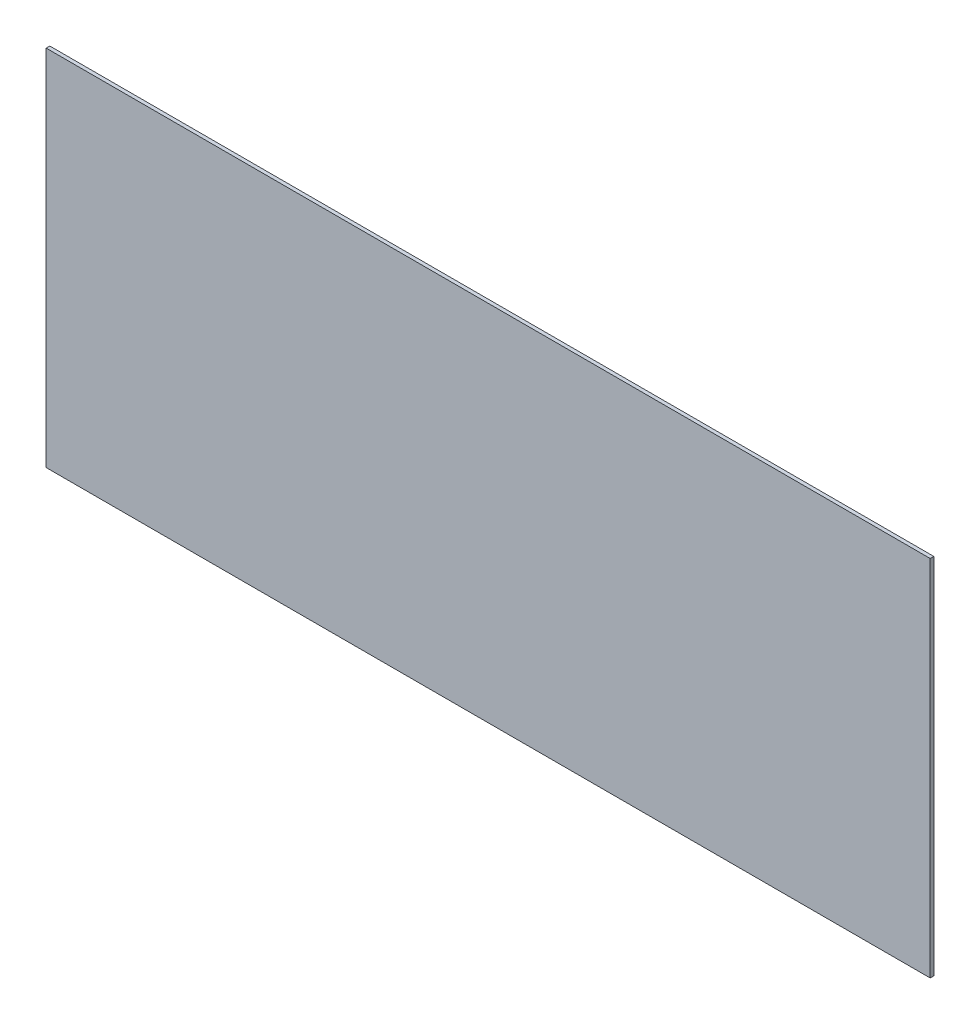
ISO-10303-21;
HEADER;
FILE_DESCRIPTION(('STEP AP214'),'2;1');
FILE_NAME('part.step','',(''),(''),'','','');
FILE_SCHEMA(('AUTOMOTIVE_DESIGN { 1 0 10303 214 1 1 1 1 }'));
ENDSEC;
DATA;
#1=APPLICATION_CONTEXT('core data for automotive mechanical design processes');
#2=APPLICATION_PROTOCOL_DEFINITION('international standard','automotive_design',2000,#1);
#3=PRODUCT_CONTEXT('',#1,'mechanical');
#4=PRODUCT('Part','Part','',(#3));
#5=PRODUCT_RELATED_PRODUCT_CATEGORY('part','',(#4));
#6=PRODUCT_DEFINITION_FORMATION('','',#4);
#7=PRODUCT_DEFINITION_CONTEXT('part definition',#1,'design');
#8=PRODUCT_DEFINITION('design','',#6,#7);
#9=PRODUCT_DEFINITION_SHAPE('','',#8);
#10=(LENGTH_UNIT() NAMED_UNIT(*) SI_UNIT(.MILLI.,.METRE.));
#11=(NAMED_UNIT(*) PLANE_ANGLE_UNIT() SI_UNIT($,.RADIAN.));
#12=(NAMED_UNIT(*) SI_UNIT($,.STERADIAN.) SOLID_ANGLE_UNIT());
#13=UNCERTAINTY_MEASURE_WITH_UNIT(LENGTH_MEASURE(1.E-05),#10,'distance_accuracy_value','');
#14=(GEOMETRIC_REPRESENTATION_CONTEXT(3) GLOBAL_UNCERTAINTY_ASSIGNED_CONTEXT((#13)) GLOBAL_UNIT_ASSIGNED_CONTEXT((#10,
#11,#12)) REPRESENTATION_CONTEXT('',''));
#15=CARTESIAN_POINT('',(0.,0.,0.));
#16=DIRECTION('',(0.,0.,1.));
#17=DIRECTION('',(1.,0.,0.));
#18=AXIS2_PLACEMENT_3D('',#15,#16,#17);
#19=CARTESIAN_POINT('',(0.,0.,3.));
#20=DIRECTION('',(-1.,0.,0.));
#21=DIRECTION('',(0.,0.,1.));
#22=AXIS2_PLACEMENT_3D('',#19,#20,#21);
#23=PLANE('',#22);
#24=DIRECTION('',(0.,1.,0.));
#25=VECTOR('',#24,1.);
#26=CARTESIAN_POINT('',(0.,0.,0.));
#27=LINE('',#26,#25);
#28=CARTESIAN_POINT('',(0.,0.,0.));
#29=VERTEX_POINT('',#28);
#30=CARTESIAN_POINT('',(0.,300.,0.));
#31=VERTEX_POINT('',#30);
#32=EDGE_CURVE('E110',#29,#31,#27,.T.);
#33=ORIENTED_EDGE('',*,*,#32,.F.);
#34=DIRECTION('',(0.,0.,-1.));
#35=VECTOR('',#34,1.);
#36=CARTESIAN_POINT('',(0.,0.,3.));
#37=LINE('',#36,#35);
#38=CARTESIAN_POINT('',(0.,0.,3.));
#39=VERTEX_POINT('',#38);
#40=EDGE_CURVE('E11',#39,#29,#37,.T.);
#41=ORIENTED_EDGE('',*,*,#40,.F.);
#42=DIRECTION('',(0.,1.,0.));
#43=VECTOR('',#42,1.);
#44=CARTESIAN_POINT('',(0.,0.,3.));
#45=LINE('',#44,#43);
#46=CARTESIAN_POINT('',(0.,300.,3.));
#47=VERTEX_POINT('',#46);
#48=EDGE_CURVE('E102',#39,#47,#45,.T.);
#49=ORIENTED_EDGE('',*,*,#48,.T.);
#50=DIRECTION('',(0.,0.,-1.));
#51=VECTOR('',#50,1.);
#52=CARTESIAN_POINT('',(0.,300.,3.));
#53=LINE('',#52,#51);
#54=EDGE_CURVE('E42',#47,#31,#53,.T.);
#55=ORIENTED_EDGE('',*,*,#54,.T.);
#56=EDGE_LOOP('',(#33,#41,#49,#55));
#57=FACE_BOUND('',#56,.T.);
#58=ADVANCED_FACE('F39',(#57),#23,.T.);
#59=CARTESIAN_POINT('',(0.,0.,3.));
#60=DIRECTION('',(0.,1.,0.));
#61=DIRECTION('',(0.,0.,1.));
#62=AXIS2_PLACEMENT_3D('',#59,#60,#61);
#63=PLANE('',#62);
#64=DIRECTION('',(1.,0.,0.));
#65=VECTOR('',#64,1.);
#66=CARTESIAN_POINT('',(0.,0.,0.));
#67=LINE('',#66,#65);
#68=CARTESIAN_POINT('',(730.,0.,0.));
#69=VERTEX_POINT('',#68);
#70=EDGE_CURVE('E105',#29,#69,#67,.T.);
#71=ORIENTED_EDGE('',*,*,#70,.T.);
#72=DIRECTION('',(0.,0.,-1.));
#73=VECTOR('',#72,1.);
#74=CARTESIAN_POINT('',(730.,0.,3.));
#75=LINE('',#74,#73);
#76=CARTESIAN_POINT('',(730.,0.,3.));
#77=VERTEX_POINT('',#76);
#78=EDGE_CURVE('E49',#77,#69,#75,.T.);
#79=ORIENTED_EDGE('',*,*,#78,.F.);
#80=DIRECTION('',(1.,0.,0.));
#81=VECTOR('',#80,1.);
#82=CARTESIAN_POINT('',(0.,0.,3.));
#83=LINE('',#82,#81);
#84=EDGE_CURVE('E97',#39,#77,#83,.T.);
#85=ORIENTED_EDGE('',*,*,#84,.F.);
#86=ORIENTED_EDGE('',*,*,#40,.T.);
#87=EDGE_LOOP('',(#71,#79,#85,#86));
#88=FACE_BOUND('',#87,.T.);
#89=ADVANCED_FACE('F125',(#88),#63,.F.);
#90=CARTESIAN_POINT('',(730.,300.,3.));
#91=DIRECTION('',(1.,0.,0.));
#92=DIRECTION('',(0.,0.,-1.));
#93=AXIS2_PLACEMENT_3D('',#90,#91,#92);
#94=PLANE('',#93);
#95=DIRECTION('',(0.,-1.,0.));
#96=VECTOR('',#95,1.);
#97=CARTESIAN_POINT('',(730.,300.,0.));
#98=LINE('',#97,#96);
#99=CARTESIAN_POINT('',(730.,300.,0.));
#100=VERTEX_POINT('',#99);
#101=EDGE_CURVE('E90',#100,#69,#98,.T.);
#102=ORIENTED_EDGE('',*,*,#101,.F.);
#103=DIRECTION('',(0.,0.,-1.));
#104=VECTOR('',#103,1.);
#105=CARTESIAN_POINT('',(730.,300.,3.));
#106=LINE('',#105,#104);
#107=CARTESIAN_POINT('',(730.,300.,3.));
#108=VERTEX_POINT('',#107);
#109=EDGE_CURVE('E85',#108,#100,#106,.T.);
#110=ORIENTED_EDGE('',*,*,#109,.F.);
#111=DIRECTION('',(0.,-1.,0.));
#112=VECTOR('',#111,1.);
#113=CARTESIAN_POINT('',(730.,300.,3.));
#114=LINE('',#113,#112);
#115=EDGE_CURVE('E88',#108,#77,#114,.T.);
#116=ORIENTED_EDGE('',*,*,#115,.T.);
#117=ORIENTED_EDGE('',*,*,#78,.T.);
#118=EDGE_LOOP('',(#102,#110,#116,#117));
#119=FACE_BOUND('',#118,.T.);
#120=ADVANCED_FACE('F87',(#119),#94,.T.);
#121=CARTESIAN_POINT('',(0.,300.,3.));
#122=DIRECTION('',(0.,1.,0.));
#123=DIRECTION('',(0.,0.,1.));
#124=AXIS2_PLACEMENT_3D('',#121,#122,#123);
#125=PLANE('',#124);
#126=DIRECTION('',(1.,0.,0.));
#127=VECTOR('',#126,1.);
#128=CARTESIAN_POINT('',(0.,300.,0.));
#129=LINE('',#128,#127);
#130=EDGE_CURVE('E114',#31,#100,#129,.T.);
#131=ORIENTED_EDGE('',*,*,#130,.F.);
#132=ORIENTED_EDGE('',*,*,#54,.F.);
#133=DIRECTION('',(1.,0.,0.));
#134=VECTOR('',#133,1.);
#135=CARTESIAN_POINT('',(0.,300.,3.));
#136=LINE('',#135,#134);
#137=EDGE_CURVE('E96',#47,#108,#136,.T.);
#138=ORIENTED_EDGE('',*,*,#137,.T.);
#139=ORIENTED_EDGE('',*,*,#109,.T.);
#140=EDGE_LOOP('',(#131,#132,#138,#139));
#141=FACE_BOUND('',#140,.T.);
#142=ADVANCED_FACE('F100',(#141),#125,.T.);
#143=CARTESIAN_POINT('',(0.,0.,3.));
#144=DIRECTION('',(0.,0.,-1.));
#145=DIRECTION('',(-1.,0.,0.));
#146=AXIS2_PLACEMENT_3D('',#143,#144,#145);
#147=PLANE('',#146);
#148=ORIENTED_EDGE('',*,*,#48,.F.);
#149=ORIENTED_EDGE('',*,*,#84,.T.);
#150=ORIENTED_EDGE('',*,*,#115,.F.);
#151=ORIENTED_EDGE('',*,*,#137,.F.);
#152=EDGE_LOOP('',(#148,#149,#150,#151));
#153=FACE_BOUND('',#152,.T.);
#154=ADVANCED_FACE('F95',(#153),#147,.F.);
#155=CARTESIAN_POINT('',(0.,0.,0.));
#156=DIRECTION('',(0.,0.,-1.));
#157=DIRECTION('',(-1.,0.,0.));
#158=AXIS2_PLACEMENT_3D('',#155,#156,#157);
#159=PLANE('',#158);
#160=ORIENTED_EDGE('',*,*,#32,.T.);
#161=ORIENTED_EDGE('',*,*,#130,.T.);
#162=ORIENTED_EDGE('',*,*,#101,.T.);
#163=ORIENTED_EDGE('',*,*,#70,.F.);
#164=EDGE_LOOP('',(#160,#161,#162,#163));
#165=FACE_BOUND('',#164,.T.);
#166=ADVANCED_FACE('F124',(#165),#159,.T.);
#167=CLOSED_SHELL('',(#58,#89,#120,#142,#154,#166));
#168=MANIFOLD_SOLID_BREP('B2',#167);
#169=ADVANCED_BREP_SHAPE_REPRESENTATION('',(#18,#168),#14);
#170=SHAPE_DEFINITION_REPRESENTATION(#9,#169);
ENDSEC;
END-ISO-10303-21;
